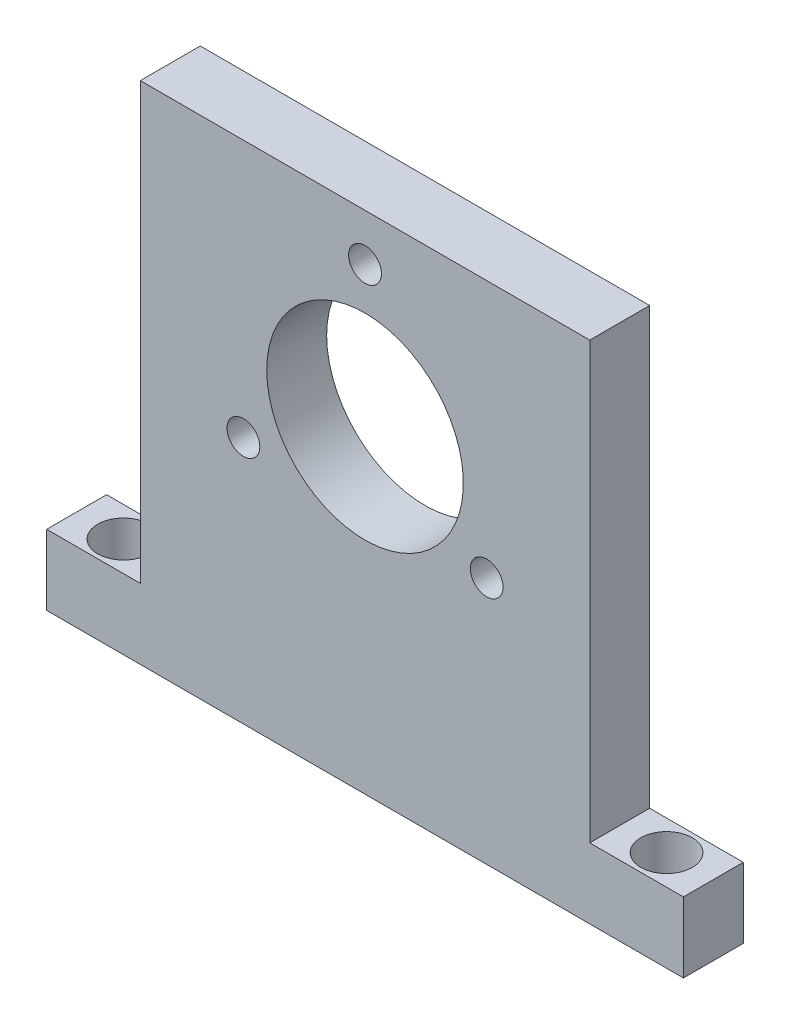
ISO-10303-21;
HEADER;
FILE_DESCRIPTION(('STEP AP214'),'2;1');
FILE_NAME('part.step','',(''),(''),'','','');
FILE_SCHEMA(('AUTOMOTIVE_DESIGN { 1 0 10303 214 1 1 1 1 }'));
ENDSEC;
DATA;
#1=APPLICATION_CONTEXT('core data for automotive mechanical design processes');
#2=APPLICATION_PROTOCOL_DEFINITION('international standard','automotive_design',2000,#1);
#3=PRODUCT_CONTEXT('',#1,'mechanical');
#4=PRODUCT('Part','Part','',(#3));
#5=PRODUCT_RELATED_PRODUCT_CATEGORY('part','',(#4));
#6=PRODUCT_DEFINITION_FORMATION('','',#4);
#7=PRODUCT_DEFINITION_CONTEXT('part definition',#1,'design');
#8=PRODUCT_DEFINITION('design','',#6,#7);
#9=PRODUCT_DEFINITION_SHAPE('','',#8);
#10=(LENGTH_UNIT() NAMED_UNIT(*) SI_UNIT(.MILLI.,.METRE.));
#11=(NAMED_UNIT(*) PLANE_ANGLE_UNIT() SI_UNIT($,.RADIAN.));
#12=(NAMED_UNIT(*) SI_UNIT($,.STERADIAN.) SOLID_ANGLE_UNIT());
#13=UNCERTAINTY_MEASURE_WITH_UNIT(LENGTH_MEASURE(1.E-05),#10,'distance_accuracy_value','');
#14=(GEOMETRIC_REPRESENTATION_CONTEXT(3) GLOBAL_UNCERTAINTY_ASSIGNED_CONTEXT((#13)) GLOBAL_UNIT_ASSIGNED_CONTEXT((#10,
#11,#12)) REPRESENTATION_CONTEXT('',''));
#15=CARTESIAN_POINT('',(0.,0.,0.));
#16=DIRECTION('',(0.,0.,1.));
#17=DIRECTION('',(1.,0.,0.));
#18=AXIS2_PLACEMENT_3D('',#15,#16,#17);
#19=CARTESIAN_POINT('',(24.,7.50000000000002,-6.40000000000002));
#20=DIRECTION('',(1.,0.,0.));
#21=DIRECTION('',(0.,1.,0.));
#22=AXIS2_PLACEMENT_3D('',#19,#20,#21);
#23=PLANE('',#22);
#24=DIRECTION('',(0.,1.,0.));
#25=VECTOR('',#24,1.);
#26=CARTESIAN_POINT('',(24.,7.50000000000001,0.));
#27=LINE('',#26,#25);
#28=CARTESIAN_POINT('',(24.,7.50000000000001,0.));
#29=VERTEX_POINT('',#28);
#30=CARTESIAN_POINT('',(24.,54.,0.));
#31=VERTEX_POINT('',#30);
#32=EDGE_CURVE('E146',#29,#31,#27,.T.);
#33=ORIENTED_EDGE('',*,*,#32,.F.);
#34=DIRECTION('',(0.,0.,1.));
#35=VECTOR('',#34,1.);
#36=CARTESIAN_POINT('',(24.,7.50000000000002,-6.40000000000002));
#37=LINE('',#36,#35);
#38=CARTESIAN_POINT('',(24.,7.50000000000002,-6.40000000000002));
#39=VERTEX_POINT('',#38);
#40=EDGE_CURVE('E11',#39,#29,#37,.T.);
#41=ORIENTED_EDGE('',*,*,#40,.F.);
#42=DIRECTION('',(0.,1.,0.));
#43=VECTOR('',#42,1.);
#44=CARTESIAN_POINT('',(24.,7.50000000000002,-6.40000000000002));
#45=LINE('',#44,#43);
#46=CARTESIAN_POINT('',(24.,54.,-6.40000000000002));
#47=VERTEX_POINT('',#46);
#48=EDGE_CURVE('E175',#39,#47,#45,.T.);
#49=ORIENTED_EDGE('',*,*,#48,.T.);
#50=DIRECTION('',(0.,0.,1.));
#51=VECTOR('',#50,1.);
#52=CARTESIAN_POINT('',(24.,54.,-6.40000000000002));
#53=LINE('',#52,#51);
#54=EDGE_CURVE('E98',#47,#31,#53,.T.);
#55=ORIENTED_EDGE('',*,*,#54,.T.);
#56=EDGE_LOOP('',(#33,#41,#49,#55));
#57=FACE_BOUND('',#56,.T.);
#58=ADVANCED_FACE('F41',(#57),#23,.T.);
#59=CARTESIAN_POINT('',(34.,7.50000000000001,-6.40000000000002));
#60=DIRECTION('',(0.,1.,0.));
#61=DIRECTION('',(0.,0.,1.));
#62=AXIS2_PLACEMENT_3D('',#59,#60,#61);
#63=PLANE('',#62);
#64=CARTESIAN_POINT('',(29.,7.50000000000005,-3.20000000000004));
#65=DIRECTION('',(0.,1.,0.));
#66=DIRECTION('',(0.,0.,1.));
#67=AXIS2_PLACEMENT_3D('',#64,#65,#66);
#68=CIRCLE('',#67,2.75);
#69=CARTESIAN_POINT('',(29.,7.50000000000004,-5.94999999999998));
#70=VERTEX_POINT('',#69);
#71=EDGE_CURVE('E271',#70,#70,#68,.F.);
#72=ORIENTED_EDGE('',*,*,#71,.T.);
#73=EDGE_LOOP('',(#72));
#74=FACE_BOUND('',#73,.T.);
#75=DIRECTION('',(-1.,0.,0.));
#76=VECTOR('',#75,1.);
#77=CARTESIAN_POINT('',(34.,7.50000000000005,0.));
#78=LINE('',#77,#76);
#79=CARTESIAN_POINT('',(34.,7.50000000000005,0.));
#80=VERTEX_POINT('',#79);
#81=EDGE_CURVE('E172',#80,#29,#78,.T.);
#82=ORIENTED_EDGE('',*,*,#81,.F.);
#83=DIRECTION('',(0.,0.,1.));
#84=VECTOR('',#83,1.);
#85=CARTESIAN_POINT('',(34.,7.50000000000001,-6.40000000000002));
#86=LINE('',#85,#84);
#87=CARTESIAN_POINT('',(34.,7.50000000000001,-6.40000000000002));
#88=VERTEX_POINT('',#87);
#89=EDGE_CURVE('E51',#88,#80,#86,.T.);
#90=ORIENTED_EDGE('',*,*,#89,.F.);
#91=DIRECTION('',(-1.,0.,0.));
#92=VECTOR('',#91,1.);
#93=CARTESIAN_POINT('',(34.,7.50000000000001,-6.40000000000002));
#94=LINE('',#93,#92);
#95=EDGE_CURVE('E131',#88,#39,#94,.T.);
#96=ORIENTED_EDGE('',*,*,#95,.T.);
#97=ORIENTED_EDGE('',*,*,#40,.T.);
#98=EDGE_LOOP('',(#82,#90,#96,#97));
#99=FACE_BOUND('',#98,.T.);
#100=ADVANCED_FACE('F195',(#74,#99),#63,.T.);
#101=CARTESIAN_POINT('',(34.,0.,-6.40000000000002));
#102=DIRECTION('',(1.,0.,0.));
#103=DIRECTION('',(0.,0.,-1.));
#104=AXIS2_PLACEMENT_3D('',#101,#102,#103);
#105=PLANE('',#104);
#106=DIRECTION('',(0.,1.,0.));
#107=VECTOR('',#106,1.);
#108=CARTESIAN_POINT('',(34.,0.,0.));
#109=LINE('',#108,#107);
#110=CARTESIAN_POINT('',(34.,0.,0.));
#111=VERTEX_POINT('',#110);
#112=EDGE_CURVE('E117',#111,#80,#109,.T.);
#113=ORIENTED_EDGE('',*,*,#112,.F.);
#114=DIRECTION('',(0.,0.,1.));
#115=VECTOR('',#114,1.);
#116=CARTESIAN_POINT('',(34.,0.,-6.40000000000002));
#117=LINE('',#116,#115);
#118=CARTESIAN_POINT('',(34.,0.,-6.40000000000002));
#119=VERTEX_POINT('',#118);
#120=EDGE_CURVE('E112',#119,#111,#117,.T.);
#121=ORIENTED_EDGE('',*,*,#120,.F.);
#122=DIRECTION('',(0.,1.,0.));
#123=VECTOR('',#122,1.);
#124=CARTESIAN_POINT('',(34.,0.,-6.40000000000002));
#125=LINE('',#124,#123);
#126=EDGE_CURVE('E115',#119,#88,#125,.T.);
#127=ORIENTED_EDGE('',*,*,#126,.T.);
#128=ORIENTED_EDGE('',*,*,#89,.T.);
#129=EDGE_LOOP('',(#113,#121,#127,#128));
#130=FACE_BOUND('',#129,.T.);
#131=ADVANCED_FACE('F114',(#130),#105,.T.);
#132=CARTESIAN_POINT('',(-34.,1.11022302462516E-13,-6.40000000000002));
#133=DIRECTION('',(0.,-1.,0.));
#134=DIRECTION('',(0.,0.,-1.));
#135=AXIS2_PLACEMENT_3D('',#132,#133,#134);
#136=PLANE('',#135);
#137=CARTESIAN_POINT('',(-29.0000000000001,1.66533453693773E-13,-3.19999999999998));
#138=DIRECTION('',(0.,1.,0.));
#139=DIRECTION('',(0.,0.,1.));
#140=AXIS2_PLACEMENT_3D('',#137,#138,#139);
#141=CIRCLE('',#140,2.75);
#142=CARTESIAN_POINT('',(-29.,1.59594559789866E-13,-5.94999999999998));
#143=VERTEX_POINT('',#142);
#144=EDGE_CURVE('E264',#143,#143,#141,.T.);
#145=ORIENTED_EDGE('',*,*,#144,.T.);
#146=EDGE_LOOP('',(#145));
#147=FACE_BOUND('',#146,.T.);
#148=CARTESIAN_POINT('',(29.,0.,-3.20000000000004));
#149=DIRECTION('',(0.,1.,0.));
#150=DIRECTION('',(0.,0.,1.));
#151=AXIS2_PLACEMENT_3D('',#148,#149,#150);
#152=CIRCLE('',#151,2.75);
#153=CARTESIAN_POINT('',(29.,0.,-5.94999999999998));
#154=VERTEX_POINT('',#153);
#155=EDGE_CURVE('E266',#154,#154,#152,.T.);
#156=ORIENTED_EDGE('',*,*,#155,.T.);
#157=EDGE_LOOP('',(#156));
#158=FACE_BOUND('',#157,.T.);
#159=DIRECTION('',(1.,0.,0.));
#160=VECTOR('',#159,1.);
#161=CARTESIAN_POINT('',(-34.,1.52655665885959E-13,0.));
#162=LINE('',#161,#160);
#163=CARTESIAN_POINT('',(-34.,1.52655665885959E-13,0.));
#164=VERTEX_POINT('',#163);
#165=EDGE_CURVE('E167',#164,#111,#162,.T.);
#166=ORIENTED_EDGE('',*,*,#165,.F.);
#167=DIRECTION('',(0.,0.,1.));
#168=VECTOR('',#167,1.);
#169=CARTESIAN_POINT('',(-34.,1.11022302462516E-13,-6.40000000000002));
#170=LINE('',#169,#168);
#171=CARTESIAN_POINT('',(-34.,1.11022302462516E-13,-6.40000000000002));
#172=VERTEX_POINT('',#171);
#173=EDGE_CURVE('E123',#172,#164,#170,.T.);
#174=ORIENTED_EDGE('',*,*,#173,.F.);
#175=DIRECTION('',(1.,0.,0.));
#176=VECTOR('',#175,1.);
#177=CARTESIAN_POINT('',(-34.,1.11022302462516E-13,-6.40000000000002));
#178=LINE('',#177,#176);
#179=EDGE_CURVE('E129',#172,#119,#178,.T.);
#180=ORIENTED_EDGE('',*,*,#179,.T.);
#181=ORIENTED_EDGE('',*,*,#120,.T.);
#182=EDGE_LOOP('',(#166,#174,#180,#181));
#183=FACE_BOUND('',#182,.T.);
#184=ADVANCED_FACE('F134',(#147,#158,#183),#136,.T.);
#185=CARTESIAN_POINT('',(-34.,7.50000000000016,-6.40000000000002));
#186=DIRECTION('',(-1.,0.,0.));
#187=DIRECTION('',(0.,0.,1.));
#188=AXIS2_PLACEMENT_3D('',#185,#186,#187);
#189=PLANE('',#188);
#190=DIRECTION('',(0.,-1.,0.));
#191=VECTOR('',#190,1.);
#192=CARTESIAN_POINT('',(-34.,7.50000000000013,0.));
#193=LINE('',#192,#191);
#194=CARTESIAN_POINT('',(-34.,7.50000000000013,0.));
#195=VERTEX_POINT('',#194);
#196=EDGE_CURVE('E163',#195,#164,#193,.T.);
#197=ORIENTED_EDGE('',*,*,#196,.F.);
#198=DIRECTION('',(0.,0.,1.));
#199=VECTOR('',#198,1.);
#200=CARTESIAN_POINT('',(-34.,7.50000000000016,-6.40000000000002));
#201=LINE('',#200,#199);
#202=CARTESIAN_POINT('',(-34.,7.50000000000016,-6.40000000000002));
#203=VERTEX_POINT('',#202);
#204=EDGE_CURVE('E181',#203,#195,#201,.T.);
#205=ORIENTED_EDGE('',*,*,#204,.F.);
#206=DIRECTION('',(0.,-1.,0.));
#207=VECTOR('',#206,1.);
#208=CARTESIAN_POINT('',(-34.,7.50000000000016,-6.40000000000002));
#209=LINE('',#208,#207);
#210=EDGE_CURVE('E136',#203,#172,#209,.T.);
#211=ORIENTED_EDGE('',*,*,#210,.T.);
#212=ORIENTED_EDGE('',*,*,#173,.T.);
#213=EDGE_LOOP('',(#197,#205,#211,#212));
#214=FACE_BOUND('',#213,.T.);
#215=ADVANCED_FACE('F210',(#214),#189,.T.);
#216=CARTESIAN_POINT('',(-24.,7.50000000000003,-6.40000000000002));
#217=DIRECTION('',(0.,1.,0.));
#218=DIRECTION('',(0.,0.,1.));
#219=AXIS2_PLACEMENT_3D('',#216,#217,#218);
#220=PLANE('',#219);
#221=CARTESIAN_POINT('',(-29.,7.50000000000017,-3.20000000000004));
#222=DIRECTION('',(0.,1.,0.));
#223=DIRECTION('',(0.,0.,1.));
#224=AXIS2_PLACEMENT_3D('',#221,#222,#223);
#225=CIRCLE('',#224,2.75);
#226=CARTESIAN_POINT('',(-29.,7.50000000000017,-5.94999999999998));
#227=VERTEX_POINT('',#226);
#228=EDGE_CURVE('E44',#227,#227,#225,.F.);
#229=ORIENTED_EDGE('',*,*,#228,.T.);
#230=EDGE_LOOP('',(#229));
#231=FACE_BOUND('',#230,.T.);
#232=DIRECTION('',(-1.,0.,0.));
#233=VECTOR('',#232,1.);
#234=CARTESIAN_POINT('',(-24.,7.50000000000006,0.));
#235=LINE('',#234,#233);
#236=CARTESIAN_POINT('',(-24.,7.50000000000006,0.));
#237=VERTEX_POINT('',#236);
#238=EDGE_CURVE('E159',#237,#195,#235,.T.);
#239=ORIENTED_EDGE('',*,*,#238,.F.);
#240=DIRECTION('',(0.,0.,1.));
#241=VECTOR('',#240,1.);
#242=CARTESIAN_POINT('',(-24.,7.50000000000003,-6.40000000000002));
#243=LINE('',#242,#241);
#244=CARTESIAN_POINT('',(-24.,7.50000000000003,-6.40000000000002));
#245=VERTEX_POINT('',#244);
#246=EDGE_CURVE('E184',#245,#237,#243,.T.);
#247=ORIENTED_EDGE('',*,*,#246,.F.);
#248=DIRECTION('',(-1.,0.,0.));
#249=VECTOR('',#248,1.);
#250=CARTESIAN_POINT('',(-24.,7.50000000000003,-6.40000000000002));
#251=LINE('',#250,#249);
#252=EDGE_CURVE('E140',#245,#203,#251,.T.);
#253=ORIENTED_EDGE('',*,*,#252,.T.);
#254=ORIENTED_EDGE('',*,*,#204,.T.);
#255=EDGE_LOOP('',(#239,#247,#253,#254));
#256=FACE_BOUND('',#255,.T.);
#257=ADVANCED_FACE('F214',(#231,#256),#220,.T.);
#258=CARTESIAN_POINT('',(-24.,54.,-6.40000000000002));
#259=DIRECTION('',(-1.,0.,0.));
#260=DIRECTION('',(0.,-1.,0.));
#261=AXIS2_PLACEMENT_3D('',#258,#259,#260);
#262=PLANE('',#261);
#263=DIRECTION('',(0.,-1.,0.));
#264=VECTOR('',#263,1.);
#265=CARTESIAN_POINT('',(-24.,54.,0.));
#266=LINE('',#265,#264);
#267=CARTESIAN_POINT('',(-24.,54.,0.));
#268=VERTEX_POINT('',#267);
#269=EDGE_CURVE('E155',#268,#237,#266,.T.);
#270=ORIENTED_EDGE('',*,*,#269,.F.);
#271=DIRECTION('',(0.,0.,1.));
#272=VECTOR('',#271,1.);
#273=CARTESIAN_POINT('',(-24.,54.,-6.40000000000002));
#274=LINE('',#273,#272);
#275=CARTESIAN_POINT('',(-24.,54.,-6.40000000000002));
#276=VERTEX_POINT('',#275);
#277=EDGE_CURVE('E187',#276,#268,#274,.T.);
#278=ORIENTED_EDGE('',*,*,#277,.F.);
#279=DIRECTION('',(0.,-1.,0.));
#280=VECTOR('',#279,1.);
#281=CARTESIAN_POINT('',(-24.,54.,-6.40000000000002));
#282=LINE('',#281,#280);
#283=EDGE_CURVE('E312',#276,#245,#282,.T.);
#284=ORIENTED_EDGE('',*,*,#283,.T.);
#285=ORIENTED_EDGE('',*,*,#246,.T.);
#286=EDGE_LOOP('',(#270,#278,#284,#285));
#287=FACE_BOUND('',#286,.T.);
#288=ADVANCED_FACE('F218',(#287),#262,.T.);
#289=CARTESIAN_POINT('',(24.,54.,-6.40000000000002));
#290=DIRECTION('',(0.,1.,0.));
#291=DIRECTION('',(0.,0.,1.));
#292=AXIS2_PLACEMENT_3D('',#289,#290,#291);
#293=PLANE('',#292);
#294=DIRECTION('',(-1.,0.,0.));
#295=VECTOR('',#294,1.);
#296=CARTESIAN_POINT('',(24.,54.,0.));
#297=LINE('',#296,#295);
#298=EDGE_CURVE('E150',#31,#268,#297,.T.);
#299=ORIENTED_EDGE('',*,*,#298,.F.);
#300=ORIENTED_EDGE('',*,*,#54,.F.);
#301=DIRECTION('',(-1.,0.,0.));
#302=VECTOR('',#301,1.);
#303=CARTESIAN_POINT('',(24.,54.,-6.40000000000002));
#304=LINE('',#303,#302);
#305=EDGE_CURVE('E309',#47,#276,#304,.T.);
#306=ORIENTED_EDGE('',*,*,#305,.T.);
#307=ORIENTED_EDGE('',*,*,#277,.T.);
#308=EDGE_LOOP('',(#299,#300,#306,#307));
#309=FACE_BOUND('',#308,.T.);
#310=ADVANCED_FACE('F191',(#309),#293,.T.);
#311=CARTESIAN_POINT('',(0.,0.,-6.40000000000002));
#312=DIRECTION('',(0.,0.,1.));
#313=DIRECTION('',(1.,0.,0.));
#314=AXIS2_PLACEMENT_3D('',#311,#312,#313);
#315=PLANE('',#314);
#316=CARTESIAN_POINT('',(-12.9903810567667,26.5000000000002,-6.40000000000002));
#317=DIRECTION('',(0.,0.,1.));
#318=DIRECTION('',(1.,0.,0.));
#319=AXIS2_PLACEMENT_3D('',#316,#317,#318);
#320=CIRCLE('',#319,1.75);
#321=CARTESIAN_POINT('',(-11.2403810567667,26.5000000000002,-6.40000000000002));
#322=VERTEX_POINT('',#321);
#323=EDGE_CURVE('E281',#322,#322,#320,.T.);
#324=ORIENTED_EDGE('',*,*,#323,.T.);
#325=EDGE_LOOP('',(#324));
#326=FACE_BOUND('',#325,.T.);
#327=CARTESIAN_POINT('',(12.9903810567665,26.5,-6.40000000000002));
#328=DIRECTION('',(0.,0.,1.));
#329=DIRECTION('',(1.,0.,0.));
#330=AXIS2_PLACEMENT_3D('',#327,#328,#329);
#331=CIRCLE('',#330,1.75);
#332=CARTESIAN_POINT('',(14.7403810567665,26.5,-6.40000000000002));
#333=VERTEX_POINT('',#332);
#334=EDGE_CURVE('E288',#333,#333,#331,.T.);
#335=ORIENTED_EDGE('',*,*,#334,.T.);
#336=EDGE_LOOP('',(#335));
#337=FACE_BOUND('',#336,.T.);
#338=CARTESIAN_POINT('',(0.,49.,-6.40000000000002));
#339=DIRECTION('',(0.,0.,1.));
#340=DIRECTION('',(1.,0.,0.));
#341=AXIS2_PLACEMENT_3D('',#338,#339,#340);
#342=CIRCLE('',#341,1.75);
#343=CARTESIAN_POINT('',(1.74999999999999,49.,-6.40000000000002));
#344=VERTEX_POINT('',#343);
#345=EDGE_CURVE('E296',#344,#344,#342,.T.);
#346=ORIENTED_EDGE('',*,*,#345,.T.);
#347=EDGE_LOOP('',(#346));
#348=FACE_BOUND('',#347,.T.);
#349=CARTESIAN_POINT('',(0.,34.0000000000001,-6.40000000000002));
#350=DIRECTION('',(0.,0.,-1.));
#351=DIRECTION('',(-1.,0.,0.));
#352=AXIS2_PLACEMENT_3D('',#349,#350,#351);
#353=CIRCLE('',#352,10.5);
#354=CARTESIAN_POINT('',(-10.5,34.0000000000001,-6.40000000000002));
#355=VERTEX_POINT('',#354);
#356=EDGE_CURVE('E300',#355,#355,#353,.T.);
#357=ORIENTED_EDGE('',*,*,#356,.F.);
#358=EDGE_LOOP('',(#357));
#359=FACE_BOUND('',#358,.T.);
#360=ORIENTED_EDGE('',*,*,#48,.F.);
#361=ORIENTED_EDGE('',*,*,#95,.F.);
#362=ORIENTED_EDGE('',*,*,#126,.F.);
#363=ORIENTED_EDGE('',*,*,#179,.F.);
#364=ORIENTED_EDGE('',*,*,#210,.F.);
#365=ORIENTED_EDGE('',*,*,#252,.F.);
#366=ORIENTED_EDGE('',*,*,#283,.F.);
#367=ORIENTED_EDGE('',*,*,#305,.F.);
#368=EDGE_LOOP('',(#360,#361,#362,#363,#364,#365,#366,#367));
#369=FACE_BOUND('',#368,.T.);
#370=ADVANCED_FACE('F127',(#326,#337,#348,#359,#369),#315,.F.);
#371=CARTESIAN_POINT('',(0.,0.,0.));
#372=DIRECTION('',(0.,0.,1.));
#373=DIRECTION('',(1.,0.,0.));
#374=AXIS2_PLACEMENT_3D('',#371,#372,#373);
#375=PLANE('',#374);
#376=CARTESIAN_POINT('',(-12.9903810567667,26.5000000000002,0.));
#377=DIRECTION('',(0.,0.,1.));
#378=DIRECTION('',(1.,0.,0.));
#379=AXIS2_PLACEMENT_3D('',#376,#377,#378);
#380=CIRCLE('',#379,1.75);
#381=CARTESIAN_POINT('',(-11.2403810567667,26.5000000000002,0.));
#382=VERTEX_POINT('',#381);
#383=EDGE_CURVE('E277',#382,#382,#380,.T.);
#384=ORIENTED_EDGE('',*,*,#383,.F.);
#385=EDGE_LOOP('',(#384));
#386=FACE_BOUND('',#385,.T.);
#387=CARTESIAN_POINT('',(12.9903810567665,26.5,0.));
#388=DIRECTION('',(0.,0.,1.));
#389=DIRECTION('',(1.,0.,0.));
#390=AXIS2_PLACEMENT_3D('',#387,#388,#389);
#391=CIRCLE('',#390,1.75);
#392=CARTESIAN_POINT('',(14.7403810567665,26.5,0.));
#393=VERTEX_POINT('',#392);
#394=EDGE_CURVE('E284',#393,#393,#391,.T.);
#395=ORIENTED_EDGE('',*,*,#394,.F.);
#396=EDGE_LOOP('',(#395));
#397=FACE_BOUND('',#396,.T.);
#398=CARTESIAN_POINT('',(0.,49.,0.));
#399=DIRECTION('',(0.,0.,1.));
#400=DIRECTION('',(1.,0.,0.));
#401=AXIS2_PLACEMENT_3D('',#398,#399,#400);
#402=CIRCLE('',#401,1.75);
#403=CARTESIAN_POINT('',(1.75,49.,0.));
#404=VERTEX_POINT('',#403);
#405=EDGE_CURVE('E292',#404,#404,#402,.T.);
#406=ORIENTED_EDGE('',*,*,#405,.F.);
#407=EDGE_LOOP('',(#406));
#408=FACE_BOUND('',#407,.T.);
#409=CARTESIAN_POINT('',(0.,34.0000000000001,0.));
#410=DIRECTION('',(0.,0.,-1.));
#411=DIRECTION('',(-1.,0.,0.));
#412=AXIS2_PLACEMENT_3D('',#409,#410,#411);
#413=CIRCLE('',#412,10.5);
#414=CARTESIAN_POINT('',(-10.5,34.0000000000001,0.));
#415=VERTEX_POINT('',#414);
#416=EDGE_CURVE('E151',#415,#415,#413,.T.);
#417=ORIENTED_EDGE('',*,*,#416,.T.);
#418=EDGE_LOOP('',(#417));
#419=FACE_BOUND('',#418,.T.);
#420=ORIENTED_EDGE('',*,*,#32,.T.);
#421=ORIENTED_EDGE('',*,*,#298,.T.);
#422=ORIENTED_EDGE('',*,*,#269,.T.);
#423=ORIENTED_EDGE('',*,*,#238,.T.);
#424=ORIENTED_EDGE('',*,*,#196,.T.);
#425=ORIENTED_EDGE('',*,*,#165,.T.);
#426=ORIENTED_EDGE('',*,*,#112,.T.);
#427=ORIENTED_EDGE('',*,*,#81,.T.);
#428=EDGE_LOOP('',(#420,#421,#422,#423,#424,#425,#426,#427));
#429=FACE_BOUND('',#428,.T.);
#430=ADVANCED_FACE('F194',(#386,#397,#408,#419,#429),#375,.T.);
#431=CARTESIAN_POINT('',(0.,34.0000000000001,0.));
#432=DIRECTION('',(0.,0.,-1.));
#433=DIRECTION('',(-1.,0.,0.));
#434=AXIS2_PLACEMENT_3D('',#431,#432,#433);
#435=CYLINDRICAL_SURFACE('',#434,10.5);
#436=ORIENTED_EDGE('',*,*,#416,.F.);
#437=EDGE_LOOP('',(#436));
#438=FACE_BOUND('',#437,.T.);
#439=ORIENTED_EDGE('',*,*,#356,.T.);
#440=EDGE_LOOP('',(#439));
#441=FACE_BOUND('',#440,.T.);
#442=ADVANCED_FACE('F230',(#438,#441),#435,.F.);
#443=CARTESIAN_POINT('',(0.,49.,0.));
#444=DIRECTION('',(0.,0.,1.));
#445=DIRECTION('',(1.,0.,0.));
#446=AXIS2_PLACEMENT_3D('',#443,#444,#445);
#447=CYLINDRICAL_SURFACE('',#446,1.75);
#448=ORIENTED_EDGE('',*,*,#345,.F.);
#449=EDGE_LOOP('',(#448));
#450=FACE_BOUND('',#449,.T.);
#451=ORIENTED_EDGE('',*,*,#405,.T.);
#452=EDGE_LOOP('',(#451));
#453=FACE_BOUND('',#452,.T.);
#454=ADVANCED_FACE('F237',(#450,#453),#447,.F.);
#455=CARTESIAN_POINT('',(12.9903810567665,26.5,0.));
#456=DIRECTION('',(0.,0.,1.));
#457=DIRECTION('',(1.,0.,0.));
#458=AXIS2_PLACEMENT_3D('',#455,#456,#457);
#459=CYLINDRICAL_SURFACE('',#458,1.75);
#460=ORIENTED_EDGE('',*,*,#334,.F.);
#461=EDGE_LOOP('',(#460));
#462=FACE_BOUND('',#461,.T.);
#463=ORIENTED_EDGE('',*,*,#394,.T.);
#464=EDGE_LOOP('',(#463));
#465=FACE_BOUND('',#464,.T.);
#466=ADVANCED_FACE('F241',(#462,#465),#459,.F.);
#467=CARTESIAN_POINT('',(-12.9903810567667,26.5000000000002,0.));
#468=DIRECTION('',(0.,0.,1.));
#469=DIRECTION('',(1.,0.,0.));
#470=AXIS2_PLACEMENT_3D('',#467,#468,#469);
#471=CYLINDRICAL_SURFACE('',#470,1.75);
#472=ORIENTED_EDGE('',*,*,#323,.F.);
#473=EDGE_LOOP('',(#472));
#474=FACE_BOUND('',#473,.T.);
#475=ORIENTED_EDGE('',*,*,#383,.T.);
#476=EDGE_LOOP('',(#475));
#477=FACE_BOUND('',#476,.T.);
#478=ADVANCED_FACE('F245',(#474,#477),#471,.F.);
#479=CARTESIAN_POINT('',(-29.,54.0000000000001,-3.19999999999998));
#480=DIRECTION('',(0.,-1.,0.));
#481=DIRECTION('',(0.,0.,-1.));
#482=AXIS2_PLACEMENT_3D('',#479,#480,#481);
#483=CYLINDRICAL_SURFACE('',#482,2.75);
#484=CARTESIAN_POINT('',(-29.,7.50000000000017,-5.94999999999998));
#485=CARTESIAN_POINT('',(-29.,7.42187500000017,-5.94999999999998));
#486=CARTESIAN_POINT('',(-29.,7.34375000000017,-5.94999999999998));
#487=CARTESIAN_POINT('',(-29.,7.18750000000016,-5.94999999999998));
#488=CARTESIAN_POINT('',(-29.,7.10937500000016,-5.94999999999998));
#489=CARTESIAN_POINT('',(-29.,6.95312500000016,-5.94999999999998));
#490=CARTESIAN_POINT('',(-29.,6.87500000000017,-5.94999999999998));
#491=CARTESIAN_POINT('',(-29.,6.71875000000017,-5.94999999999998));
#492=CARTESIAN_POINT('',(-29.,6.64062500000017,-5.94999999999998));
#493=CARTESIAN_POINT('',(-29.,6.48437500000016,-5.94999999999998));
#494=CARTESIAN_POINT('',(-29.,6.40625000000016,-5.94999999999998));
#495=CARTESIAN_POINT('',(-29.,6.25000000000017,-5.94999999999998));
#496=CARTESIAN_POINT('',(-29.,6.17187500000017,-5.94999999999998));
#497=CARTESIAN_POINT('',(-29.,6.01562500000017,-5.94999999999998));
#498=CARTESIAN_POINT('',(-29.,5.93750000000017,-5.94999999999998));
#499=CARTESIAN_POINT('',(-29.,5.78125000000017,-5.94999999999998));
#500=CARTESIAN_POINT('',(-29.,5.70312500000017,-5.94999999999998));
#501=CARTESIAN_POINT('',(-29.,5.54687500000016,-5.94999999999998));
#502=CARTESIAN_POINT('',(-29.,5.46875000000016,-5.94999999999998));
#503=CARTESIAN_POINT('',(-29.,5.31250000000016,-5.94999999999998));
#504=CARTESIAN_POINT('',(-29.,5.23437500000016,-5.94999999999998));
#505=CARTESIAN_POINT('',(-29.,5.07812500000016,-5.94999999999998));
#506=CARTESIAN_POINT('',(-29.,5.00000000000016,-5.94999999999998));
#507=CARTESIAN_POINT('',(-29.,4.84375000000017,-5.94999999999998));
#508=CARTESIAN_POINT('',(-29.,4.76562500000016,-5.94999999999998));
#509=CARTESIAN_POINT('',(-29.,4.60937500000016,-5.94999999999998));
#510=CARTESIAN_POINT('',(-29.,4.53125000000016,-5.94999999999998));
#511=CARTESIAN_POINT('',(-29.,4.37500000000016,-5.94999999999998));
#512=CARTESIAN_POINT('',(-29.,4.29687500000017,-5.94999999999998));
#513=CARTESIAN_POINT('',(-29.,4.14062500000017,-5.94999999999998));
#514=CARTESIAN_POINT('',(-29.,4.06250000000017,-5.94999999999998));
#515=CARTESIAN_POINT('',(-29.,3.90625000000016,-5.94999999999998));
#516=CARTESIAN_POINT('',(-29.,3.82812500000016,-5.94999999999998));
#517=CARTESIAN_POINT('',(-29.,3.67187500000016,-5.94999999999998));
#518=CARTESIAN_POINT('',(-29.,3.59375000000016,-5.94999999999998));
#519=CARTESIAN_POINT('',(-29.,3.43750000000016,-5.94999999999998));
#520=CARTESIAN_POINT('',(-29.,3.35937500000016,-5.94999999999998));
#521=CARTESIAN_POINT('',(-29.,3.20312500000016,-5.94999999999998));
#522=CARTESIAN_POINT('',(-29.,3.12500000000016,-5.94999999999998));
#523=CARTESIAN_POINT('',(-29.,2.96875000000016,-5.94999999999998));
#524=CARTESIAN_POINT('',(-29.,2.89062500000016,-5.94999999999998));
#525=CARTESIAN_POINT('',(-29.,2.73437500000016,-5.94999999999998));
#526=CARTESIAN_POINT('',(-29.,2.65625000000016,-5.94999999999998));
#527=CARTESIAN_POINT('',(-29.,2.50000000000016,-5.94999999999998));
#528=CARTESIAN_POINT('',(-29.,2.42187500000016,-5.94999999999998));
#529=CARTESIAN_POINT('',(-29.,2.26562500000016,-5.94999999999998));
#530=CARTESIAN_POINT('',(-29.,2.18750000000016,-5.94999999999998));
#531=CARTESIAN_POINT('',(-29.,2.03125000000016,-5.94999999999998));
#532=CARTESIAN_POINT('',(-29.,1.95312500000016,-5.94999999999998));
#533=CARTESIAN_POINT('',(-29.,1.79687500000016,-5.94999999999998));
#534=CARTESIAN_POINT('',(-29.,1.71875000000016,-5.94999999999998));
#535=CARTESIAN_POINT('',(-29.,1.56250000000016,-5.94999999999998));
#536=CARTESIAN_POINT('',(-29.,1.48437500000016,-5.94999999999998));
#537=CARTESIAN_POINT('',(-29.,1.32812500000016,-5.94999999999998));
#538=CARTESIAN_POINT('',(-29.,1.25000000000016,-5.94999999999998));
#539=CARTESIAN_POINT('',(-29.,1.09375000000016,-5.94999999999998));
#540=CARTESIAN_POINT('',(-29.,1.01562500000016,-5.94999999999998));
#541=CARTESIAN_POINT('',(-29.,0.85937500000016,-5.94999999999998));
#542=CARTESIAN_POINT('',(-29.,0.781250000000159,-5.94999999999998));
#543=CARTESIAN_POINT('',(-29.,0.62500000000016,-5.94999999999998));
#544=CARTESIAN_POINT('',(-29.,0.546875000000162,-5.94999999999998));
#545=CARTESIAN_POINT('',(-29.,0.390625000000163,-5.94999999999998));
#546=CARTESIAN_POINT('',(-29.,0.312500000000162,-5.94999999999998));
#547=CARTESIAN_POINT('',(-29.,0.156250000000161,-5.94999999999998));
#548=CARTESIAN_POINT('',(-29.,0.0781250000001602,-5.94999999999998));
#549=CARTESIAN_POINT('',(-29.,1.59594559789866E-13,-5.94999999999998));
#550=B_SPLINE_CURVE_WITH_KNOTS('',3,(#484,#485,#486,#487,#488,#489,#490,#491,#492,#493,#494,
#495,#496,#497,#498,#499,#500,#501,#502,#503,#504,#505,#506,#507,#508,#509,#510,#511,#512,#513,
#514,#515,#516,#517,#518,#519,#520,#521,#522,#523,#524,#525,#526,#527,#528,#529,#530,#531,#532,
#533,#534,#535,#536,#537,#538,#539,#540,#541,#542,#543,#544,#545,#546,#547,#548,#549),
.UNSPECIFIED.,.F.,.F.,(4,2,2,2,2,2,2,2,2,2,2,2,2,2,2,2,2,2,2,2,2,2,2,2,2,2,2,2,2,2,2,2,4),(0.,
0.234375000000002,0.468750000000004,0.703124999999999,0.937500000000001,1.171875,1.40625,
1.640625,1.875,2.109375,2.34375000000001,2.578125,2.8125,3.046875,3.28125,3.515625,3.75,
3.98437500000001,4.21875000000001,4.453125,4.6875,4.92187500000001,5.15625,5.390625,
5.62500000000001,5.85937500000001,6.09375000000001,6.328125,6.56250000000001,6.79687500000001,
7.03125,7.265625,7.50000000000001),.UNSPECIFIED.);
#551=EDGE_CURVE('BSEAM249',#227,#143,#550,.T.);
#552=ORIENTED_EDGE('',*,*,#228,.F.);
#553=ORIENTED_EDGE('',*,*,#144,.F.);
#554=ORIENTED_EDGE('',*,*,#551,.T.);
#555=ORIENTED_EDGE('',*,*,#551,.F.);
#556=EDGE_LOOP('',(#552,#554,#553,#555));
#557=FACE_BOUND('',#556,.T.);
#558=ADVANCED_FACE('F249',(#557),#483,.F.);
#559=CARTESIAN_POINT('',(29.,54.,-3.19999999999998));
#560=DIRECTION('',(0.,-1.,0.));
#561=DIRECTION('',(0.,0.,-1.));
#562=AXIS2_PLACEMENT_3D('',#559,#560,#561);
#563=CYLINDRICAL_SURFACE('',#562,2.75);
#564=CARTESIAN_POINT('',(29.,7.50000000000004,-5.94999999999998));
#565=CARTESIAN_POINT('',(29.,7.42187500000004,-5.94999999999998));
#566=CARTESIAN_POINT('',(29.,7.34375000000004,-5.94999999999998));
#567=CARTESIAN_POINT('',(29.,7.18750000000004,-5.94999999999998));
#568=CARTESIAN_POINT('',(29.,7.10937500000004,-5.94999999999998));
#569=CARTESIAN_POINT('',(29.,6.95312500000004,-5.94999999999998));
#570=CARTESIAN_POINT('',(29.,6.87500000000004,-5.94999999999998));
#571=CARTESIAN_POINT('',(29.,6.71875000000003,-5.94999999999998));
#572=CARTESIAN_POINT('',(29.,6.64062500000003,-5.94999999999998));
#573=CARTESIAN_POINT('',(29.,6.48437500000003,-5.94999999999998));
#574=CARTESIAN_POINT('',(29.,6.40625000000003,-5.94999999999998));
#575=CARTESIAN_POINT('',(29.,6.25000000000003,-5.94999999999998));
#576=CARTESIAN_POINT('',(29.,6.17187500000003,-5.94999999999998));
#577=CARTESIAN_POINT('',(29.,6.01562500000003,-5.94999999999998));
#578=CARTESIAN_POINT('',(29.,5.93750000000003,-5.94999999999998));
#579=CARTESIAN_POINT('',(29.,5.78125000000003,-5.94999999999998));
#580=CARTESIAN_POINT('',(29.,5.70312500000003,-5.94999999999998));
#581=CARTESIAN_POINT('',(29.,5.54687500000002,-5.94999999999998));
#582=CARTESIAN_POINT('',(29.,5.46875000000002,-5.94999999999998));
#583=CARTESIAN_POINT('',(29.,5.31250000000002,-5.94999999999998));
#584=CARTESIAN_POINT('',(29.,5.23437500000002,-5.94999999999998));
#585=CARTESIAN_POINT('',(29.,5.07812500000001,-5.94999999999998));
#586=CARTESIAN_POINT('',(29.,5.00000000000001,-5.94999999999998));
#587=CARTESIAN_POINT('',(29.,4.84375000000001,-5.94999999999998));
#588=CARTESIAN_POINT('',(29.,4.76562500000001,-5.94999999999998));
#589=CARTESIAN_POINT('',(29.,4.60937500000001,-5.94999999999998));
#590=CARTESIAN_POINT('',(29.,4.53125000000001,-5.94999999999998));
#591=CARTESIAN_POINT('',(29.,4.37500000000001,-5.94999999999998));
#592=CARTESIAN_POINT('',(29.,4.29687500000001,-5.94999999999998));
#593=CARTESIAN_POINT('',(29.,4.14062500000001,-5.94999999999998));
#594=CARTESIAN_POINT('',(29.,4.06250000000001,-5.94999999999998));
#595=CARTESIAN_POINT('',(29.,3.90625,-5.94999999999998));
#596=CARTESIAN_POINT('',(29.,3.828125,-5.94999999999998));
#597=CARTESIAN_POINT('',(29.,3.671875,-5.94999999999998));
#598=CARTESIAN_POINT('',(29.,3.59375,-5.94999999999998));
#599=CARTESIAN_POINT('',(29.,3.4375,-5.94999999999998));
#600=CARTESIAN_POINT('',(29.,3.359375,-5.94999999999998));
#601=CARTESIAN_POINT('',(29.,3.203125,-5.94999999999998));
#602=CARTESIAN_POINT('',(29.,3.125,-5.94999999999998));
#603=CARTESIAN_POINT('',(29.,2.96875,-5.94999999999998));
#604=CARTESIAN_POINT('',(29.,2.890625,-5.94999999999998));
#605=CARTESIAN_POINT('',(29.,2.734375,-5.94999999999998));
#606=CARTESIAN_POINT('',(29.,2.65624999999999,-5.94999999999998));
#607=CARTESIAN_POINT('',(29.,2.49999999999999,-5.94999999999998));
#608=CARTESIAN_POINT('',(29.,2.42187499999999,-5.94999999999998));
#609=CARTESIAN_POINT('',(29.,2.26562499999999,-5.94999999999998));
#610=CARTESIAN_POINT('',(29.,2.18749999999999,-5.94999999999998));
#611=CARTESIAN_POINT('',(29.,2.03124999999999,-5.94999999999998));
#612=CARTESIAN_POINT('',(29.,1.95312499999998,-5.94999999999998));
#613=CARTESIAN_POINT('',(29.,1.79687499999998,-5.94999999999998));
#614=CARTESIAN_POINT('',(29.,1.71874999999998,-5.94999999999998));
#615=CARTESIAN_POINT('',(29.,1.56249999999998,-5.94999999999998));
#616=CARTESIAN_POINT('',(29.,1.48437499999998,-5.94999999999998));
#617=CARTESIAN_POINT('',(29.,1.32812499999998,-5.94999999999998));
#618=CARTESIAN_POINT('',(29.,1.24999999999998,-5.94999999999998));
#619=CARTESIAN_POINT('',(29.,1.09374999999997,-5.94999999999998));
#620=CARTESIAN_POINT('',(29.,1.01562499999997,-5.94999999999998));
#621=CARTESIAN_POINT('',(29.,0.859374999999972,-5.94999999999998));
#622=CARTESIAN_POINT('',(29.,0.781249999999972,-5.94999999999998));
#623=CARTESIAN_POINT('',(29.,0.62499999999997,-5.94999999999998));
#624=CARTESIAN_POINT('',(29.,0.54687499999997,-5.94999999999998));
#625=CARTESIAN_POINT('',(29.,0.390624999999969,-5.94999999999998));
#626=CARTESIAN_POINT('',(29.,0.312499999999968,-5.94999999999998));
#627=CARTESIAN_POINT('',(29.,0.156249999999967,-5.94999999999998));
#628=CARTESIAN_POINT('',(29.,0.0781249999999659,-5.94999999999998));
#629=CARTESIAN_POINT('',(29.,0.,-5.94999999999998));
#630=B_SPLINE_CURVE_WITH_KNOTS('',3,(#564,#565,#566,#567,#568,#569,#570,#571,#572,#573,#574,
#575,#576,#577,#578,#579,#580,#581,#582,#583,#584,#585,#586,#587,#588,#589,#590,#591,#592,#593,
#594,#595,#596,#597,#598,#599,#600,#601,#602,#603,#604,#605,#606,#607,#608,#609,#610,#611,#612,
#613,#614,#615,#616,#617,#618,#619,#620,#621,#622,#623,#624,#625,#626,#627,#628,#629),
.UNSPECIFIED.,.F.,.F.,(4,2,2,2,2,2,2,2,2,2,2,2,2,2,2,2,2,2,2,2,2,2,2,2,2,2,2,2,2,2,2,2,4),(0.,
0.234375000000002,0.468750000000004,0.703125000000006,0.937500000000008,1.17187500000001,
1.40625000000001,1.64062500000001,1.87500000000002,2.10937500000002,2.34375000000003,
2.57812500000003,2.81250000000003,3.04687500000003,3.28125000000003,3.51562500000004,
3.75000000000004,3.98437500000004,4.21875000000004,4.45312500000004,4.68750000000005,
4.92187500000005,5.15625000000005,5.39062500000005,5.62500000000006,5.85937500000006,
6.09375000000006,6.32812500000007,6.56250000000007,6.79687500000007,7.03125000000007,
7.26562500000007,7.50000000000008),.UNSPECIFIED.);
#631=EDGE_CURVE('BSEAM251',#70,#154,#630,.T.);
#632=ORIENTED_EDGE('',*,*,#71,.F.);
#633=ORIENTED_EDGE('',*,*,#155,.F.);
#634=ORIENTED_EDGE('',*,*,#631,.T.);
#635=ORIENTED_EDGE('',*,*,#631,.F.);
#636=EDGE_LOOP('',(#632,#634,#633,#635));
#637=FACE_BOUND('',#636,.T.);
#638=ADVANCED_FACE('F251',(#637),#563,.F.);
#639=CLOSED_SHELL('',(#58,#100,#131,#184,#215,#257,#288,#310,#370,#430,#442,#454,#466,#478,#558,#638));
#640=MANIFOLD_SOLID_BREP('B2',#639);
#641=ADVANCED_BREP_SHAPE_REPRESENTATION('',(#18,#640),#14);
#642=SHAPE_DEFINITION_REPRESENTATION(#9,#641);
ENDSEC;
END-ISO-10303-21;
